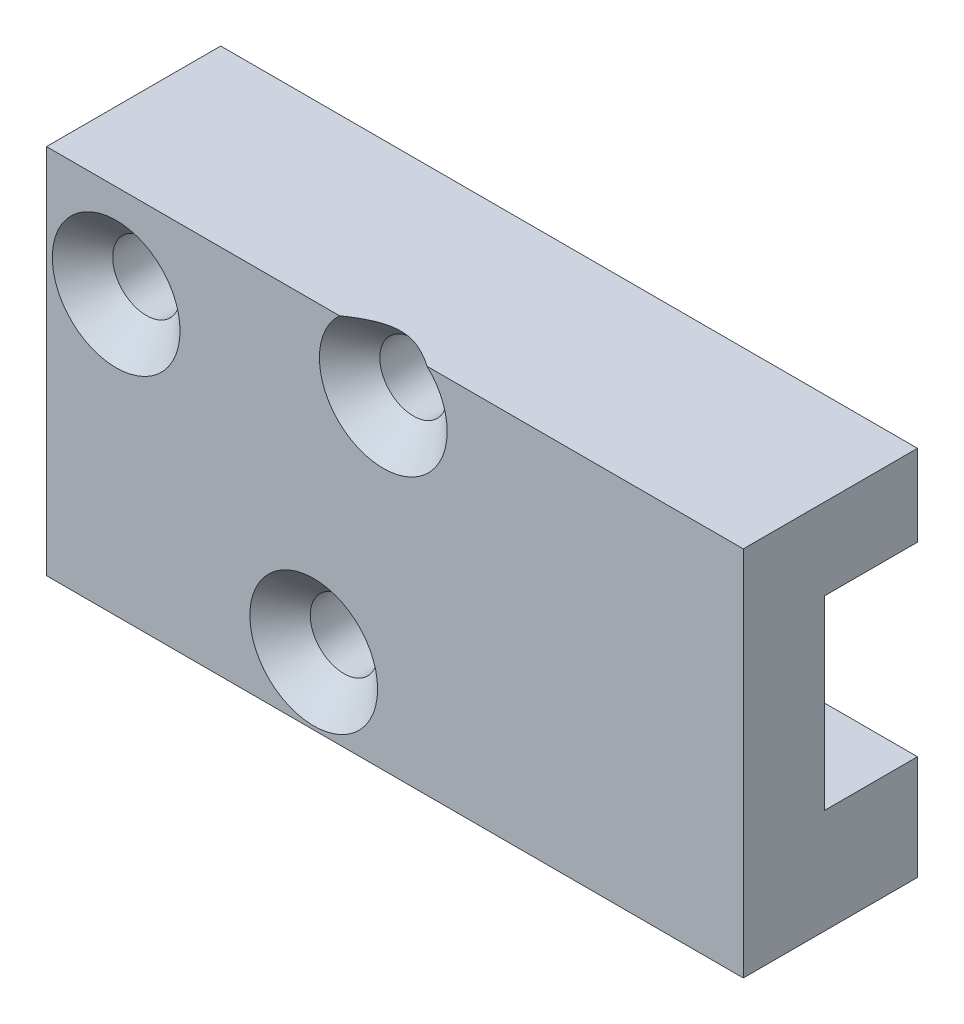
ISO-10303-21;
HEADER;
FILE_DESCRIPTION(('STEP AP214'),'2;1');
FILE_NAME('part.step','',(''),(''),'','','');
FILE_SCHEMA(('AUTOMOTIVE_DESIGN { 1 0 10303 214 1 1 1 1 }'));
ENDSEC;
DATA;
#1=APPLICATION_CONTEXT('core data for automotive mechanical design processes');
#2=APPLICATION_PROTOCOL_DEFINITION('international standard','automotive_design',2000,#1);
#3=PRODUCT_CONTEXT('',#1,'mechanical');
#4=PRODUCT('Part','Part','',(#3));
#5=PRODUCT_RELATED_PRODUCT_CATEGORY('part','',(#4));
#6=PRODUCT_DEFINITION_FORMATION('','',#4);
#7=PRODUCT_DEFINITION_CONTEXT('part definition',#1,'design');
#8=PRODUCT_DEFINITION('design','',#6,#7);
#9=PRODUCT_DEFINITION_SHAPE('','',#8);
#10=(LENGTH_UNIT() NAMED_UNIT(*) SI_UNIT(.MILLI.,.METRE.));
#11=(NAMED_UNIT(*) PLANE_ANGLE_UNIT() SI_UNIT($,.RADIAN.));
#12=(NAMED_UNIT(*) SI_UNIT($,.STERADIAN.) SOLID_ANGLE_UNIT());
#13=UNCERTAINTY_MEASURE_WITH_UNIT(LENGTH_MEASURE(1.E-05),#10,'distance_accuracy_value','');
#14=(GEOMETRIC_REPRESENTATION_CONTEXT(3) GLOBAL_UNCERTAINTY_ASSIGNED_CONTEXT((#13)) GLOBAL_UNIT_ASSIGNED_CONTEXT((#10,
#11,#12)) REPRESENTATION_CONTEXT('',''));
#15=CARTESIAN_POINT('',(0.,0.,0.));
#16=DIRECTION('',(0.,0.,1.));
#17=DIRECTION('',(1.,0.,0.));
#18=AXIS2_PLACEMENT_3D('',#15,#16,#17);
#19=CARTESIAN_POINT('',(0.,0.,8.07911505586116));
#20=DIRECTION('',(0.,0.,-1.));
#21=DIRECTION('',(-1.,0.,0.));
#22=AXIS2_PLACEMENT_3D('',#19,#20,#21);
#23=PLANE('',#22);
#24=CARTESIAN_POINT('',(102.394950361499,-11.8061342603226,8.07911505586116));
#25=DIRECTION('',(0.,0.,1.));
#26=DIRECTION('',(1.,0.,0.));
#27=AXIS2_PLACEMENT_3D('',#24,#25,#26);
#28=CIRCLE('',#27,2.75);
#29=CARTESIAN_POINT('',(105.144950361499,-11.8061342603226,8.07911505586116));
#30=VERTEX_POINT('',#29);
#31=EDGE_CURVE('E518',#30,#30,#28,.T.);
#32=ORIENTED_EDGE('',*,*,#31,.F.);
#33=EDGE_LOOP('',(#32));
#34=FACE_BOUND('',#33,.T.);
#35=CARTESIAN_POINT('',(110.89995175116,-20.9061342603226,8.07911505586116));
#36=DIRECTION('',(0.,0.,1.));
#37=DIRECTION('',(1.,0.,0.));
#38=AXIS2_PLACEMENT_3D('',#35,#36,#37);
#39=CIRCLE('',#38,2.75);
#40=CARTESIAN_POINT('',(113.64995175116,-20.9061342603226,8.07911505586116));
#41=VERTEX_POINT('',#40);
#42=EDGE_CURVE('E534',#41,#41,#39,.T.);
#43=ORIENTED_EDGE('',*,*,#42,.F.);
#44=EDGE_LOOP('',(#43));
#45=FACE_BOUND('',#44,.T.);
#46=CARTESIAN_POINT('',(113.894950361499,-9.80613426032264,8.07911505586116));
#47=DIRECTION('',(0.,0.,1.));
#48=DIRECTION('',(1.,0.,0.));
#49=AXIS2_PLACEMENT_3D('',#46,#47,#48);
#50=CIRCLE('',#49,2.75);
#51=CARTESIAN_POINT('',(112.007491752681,-7.80613426032264,8.07911505586116));
#52=VERTEX_POINT('',#51);
#53=CARTESIAN_POINT('',(115.782408970316,-7.80613426032264,8.07911505586116));
#54=VERTEX_POINT('',#53);
#55=EDGE_CURVE('E110',#52,#54,#50,.T.);
#56=ORIENTED_EDGE('',*,*,#55,.F.);
#57=DIRECTION('',(-1.,0.,0.));
#58=VECTOR('',#57,1.);
#59=CARTESIAN_POINT('',(99.3949503614988,-7.80613426032264,8.07911505586116));
#60=LINE('',#59,#58);
#61=CARTESIAN_POINT('',(99.3949503614988,-7.80613426032264,8.07911505586116));
#62=VERTEX_POINT('',#61);
#63=EDGE_CURVE('E316',#52,#62,#60,.T.);
#64=ORIENTED_EDGE('',*,*,#63,.T.);
#65=DIRECTION('',(0.,-1.,0.));
#66=VECTOR('',#65,1.);
#67=CARTESIAN_POINT('',(99.3949503614988,-23.8061342603226,8.07911505586116));
#68=LINE('',#67,#66);
#69=CARTESIAN_POINT('',(99.3949503614988,-23.8061342603226,8.07911505586116));
#70=VERTEX_POINT('',#69);
#71=EDGE_CURVE('E330',#62,#70,#68,.T.);
#72=ORIENTED_EDGE('',*,*,#71,.T.);
#73=DIRECTION('',(1.,0.,0.));
#74=VECTOR('',#73,1.);
#75=CARTESIAN_POINT('',(129.394950361499,-23.8061342603226,8.07911505586116));
#76=LINE('',#75,#74);
#77=CARTESIAN_POINT('',(129.394950361499,-23.8061342603226,8.07911505586116));
#78=VERTEX_POINT('',#77);
#79=EDGE_CURVE('E331',#70,#78,#76,.T.);
#80=ORIENTED_EDGE('',*,*,#79,.T.);
#81=DIRECTION('',(0.,1.,0.));
#82=VECTOR('',#81,1.);
#83=CARTESIAN_POINT('',(129.394950361499,-7.80613426032264,8.07911505586116));
#84=LINE('',#83,#82);
#85=CARTESIAN_POINT('',(129.394950361499,-7.80613426032264,8.07911505586116));
#86=VERTEX_POINT('',#85);
#87=EDGE_CURVE('E235',#78,#86,#84,.T.);
#88=ORIENTED_EDGE('',*,*,#87,.T.);
#89=EDGE_CURVE('E318',#86,#54,#60,.T.);
#90=ORIENTED_EDGE('',*,*,#89,.T.);
#91=EDGE_LOOP('',(#56,#64,#72,#80,#88,#90));
#92=FACE_BOUND('',#91,.T.);
#93=ADVANCED_FACE('F89',(#34,#45,#92),#23,.F.);
#94=CARTESIAN_POINT('',(0.,-18.3061342603226,4.57911505586116));
#95=DIRECTION('',(0.,1.,0.));
#96=DIRECTION('',(0.,0.,1.));
#97=AXIS2_PLACEMENT_3D('',#94,#95,#96);
#98=PLANE('',#97);
#99=DIRECTION('',(1.,0.,0.));
#100=VECTOR('',#99,1.);
#101=CARTESIAN_POINT('',(0.,-18.3061342603226,0.579115055861165));
#102=LINE('',#101,#100);
#103=CARTESIAN_POINT('',(110.394950361499,-18.3061342603226,0.579115055861165));
#104=VERTEX_POINT('',#103);
#105=CARTESIAN_POINT('',(116.394950361499,-18.3061342603226,0.579115055861165));
#106=VERTEX_POINT('',#105);
#107=EDGE_CURVE('E171',#104,#106,#102,.T.);
#108=ORIENTED_EDGE('',*,*,#107,.F.);
#109=DIRECTION('',(0.,0.,-1.));
#110=VECTOR('',#109,1.);
#111=CARTESIAN_POINT('',(110.394950361499,-18.3061342603226,4.57911505586116));
#112=LINE('',#111,#110);
#113=CARTESIAN_POINT('',(110.394950361499,-18.3061342603226,4.57911505586116));
#114=VERTEX_POINT('',#113);
#115=EDGE_CURVE('E104',#114,#104,#112,.T.);
#116=ORIENTED_EDGE('',*,*,#115,.F.);
#117=DIRECTION('',(1.,0.,0.));
#118=VECTOR('',#117,1.);
#119=CARTESIAN_POINT('',(0.,-18.3061342603226,4.57911505586116));
#120=LINE('',#119,#118);
#121=CARTESIAN_POINT('',(116.394950361499,-18.3061342603226,4.57911505586116));
#122=VERTEX_POINT('',#121);
#123=EDGE_CURVE('E173',#114,#122,#120,.T.);
#124=ORIENTED_EDGE('',*,*,#123,.T.);
#125=DIRECTION('',(0.,0.,-1.));
#126=VECTOR('',#125,1.);
#127=CARTESIAN_POINT('',(116.394950361499,-18.3061342603226,4.57911505586116));
#128=LINE('',#127,#126);
#129=EDGE_CURVE('E155',#122,#106,#128,.T.);
#130=ORIENTED_EDGE('',*,*,#129,.T.);
#131=EDGE_LOOP('',(#108,#116,#124,#130));
#132=FACE_BOUND('',#131,.T.);
#133=ADVANCED_FACE('F91',(#132),#98,.T.);
#134=CARTESIAN_POINT('',(110.384915749115,-21.3061174780348,4.57911505586116));
#135=DIRECTION('',(0.,0.,-1.));
#136=DIRECTION('',(-1.,0.,0.));
#137=AXIS2_PLACEMENT_3D('',#134,#135,#136);
#138=CYLINDRICAL_SURFACE('',#137,3.00000000000001);
#139=CARTESIAN_POINT('',(110.384915749115,-21.3061174780348,0.579115055861165));
#140=DIRECTION('',(0.,0.,1.));
#141=DIRECTION('',(1.,0.,0.));
#142=AXIS2_PLACEMENT_3D('',#139,#140,#141);
#143=CIRCLE('',#142,3.00000000000001);
#144=CARTESIAN_POINT('',(107.39995175116,-21.0061342603226,0.579115055861165));
#145=VERTEX_POINT('',#144);
#146=EDGE_CURVE('E200',#104,#145,#143,.T.);
#147=ORIENTED_EDGE('',*,*,#146,.T.);
#148=DIRECTION('',(0.,0.,-1.));
#149=VECTOR('',#148,1.);
#150=CARTESIAN_POINT('',(107.39995175116,-21.0061342603226,4.57911505586116));
#151=LINE('',#150,#149);
#152=CARTESIAN_POINT('',(107.39995175116,-21.0061342603226,4.57911505586116));
#153=VERTEX_POINT('',#152);
#154=EDGE_CURVE('E191',#153,#145,#151,.T.);
#155=ORIENTED_EDGE('',*,*,#154,.F.);
#156=CARTESIAN_POINT('',(110.384915749115,-21.3061174780348,4.57911505586116));
#157=DIRECTION('',(0.,0.,1.));
#158=DIRECTION('',(1.,0.,0.));
#159=AXIS2_PLACEMENT_3D('',#156,#157,#158);
#160=CIRCLE('',#159,3.00000000000001);
#161=EDGE_CURVE('E177',#114,#153,#160,.T.);
#162=ORIENTED_EDGE('',*,*,#161,.F.);
#163=ORIENTED_EDGE('',*,*,#115,.T.);
#164=EDGE_LOOP('',(#147,#155,#162,#163));
#165=FACE_BOUND('',#164,.T.);
#166=ADVANCED_FACE('F198',(#165),#138,.T.);
#167=CARTESIAN_POINT('',(107.39995175116,0.,4.57911505586116));
#168=DIRECTION('',(-1.,0.,0.));
#169=DIRECTION('',(0.,0.,1.));
#170=AXIS2_PLACEMENT_3D('',#167,#168,#169);
#171=PLANE('',#170);
#172=DIRECTION('',(0.,1.,0.));
#173=VECTOR('',#172,1.);
#174=CARTESIAN_POINT('',(107.39995175116,0.,0.579115055861165));
#175=LINE('',#174,#173);
#176=CARTESIAN_POINT('',(107.39995175116,-23.8061342603226,0.579115055861165));
#177=VERTEX_POINT('',#176);
#178=EDGE_CURVE('E207',#177,#145,#175,.T.);
#179=ORIENTED_EDGE('',*,*,#178,.F.);
#180=DIRECTION('',(0.,0.,-1.));
#181=VECTOR('',#180,1.);
#182=CARTESIAN_POINT('',(107.39995175116,-23.8061342603226,4.57911505586116));
#183=LINE('',#182,#181);
#184=CARTESIAN_POINT('',(107.39995175116,-23.8061342603226,4.57911505586116));
#185=VERTEX_POINT('',#184);
#186=EDGE_CURVE('E188',#185,#177,#183,.T.);
#187=ORIENTED_EDGE('',*,*,#186,.F.);
#188=DIRECTION('',(0.,1.,0.));
#189=VECTOR('',#188,1.);
#190=CARTESIAN_POINT('',(107.39995175116,0.,4.57911505586116));
#191=LINE('',#190,#189);
#192=EDGE_CURVE('E250',#185,#153,#191,.T.);
#193=ORIENTED_EDGE('',*,*,#192,.T.);
#194=ORIENTED_EDGE('',*,*,#154,.T.);
#195=EDGE_LOOP('',(#179,#187,#193,#194));
#196=FACE_BOUND('',#195,.T.);
#197=ADVANCED_FACE('F249',(#196),#171,.T.);
#198=CARTESIAN_POINT('',(0.,-23.8061342603226,4.57911505586116));
#199=DIRECTION('',(0.,-1.,0.));
#200=DIRECTION('',(0.,0.,-1.));
#201=AXIS2_PLACEMENT_3D('',#198,#199,#200);
#202=PLANE('',#201);
#203=DIRECTION('',(-1.,0.,0.));
#204=VECTOR('',#203,1.);
#205=CARTESIAN_POINT('',(0.,-23.8061342603226,0.579115055861165));
#206=LINE('',#205,#204);
#207=CARTESIAN_POINT('',(129.394950361499,-23.8061342603226,0.579115055861165));
#208=VERTEX_POINT('',#207);
#209=EDGE_CURVE('E222',#208,#177,#206,.T.);
#210=ORIENTED_EDGE('',*,*,#209,.F.);
#211=DIRECTION('',(0.,0.,-1.));
#212=VECTOR('',#211,1.);
#213=CARTESIAN_POINT('',(129.394950361499,-23.8061342603226,4.57911505586116));
#214=LINE('',#213,#212);
#215=EDGE_CURVE('E185',#78,#208,#214,.T.);
#216=ORIENTED_EDGE('',*,*,#215,.F.);
#217=ORIENTED_EDGE('',*,*,#79,.F.);
#218=DIRECTION('',(0.,0.,-1.));
#219=VECTOR('',#218,1.);
#220=CARTESIAN_POINT('',(99.3949503614988,-23.8061342603226,8.07911505586116));
#221=LINE('',#220,#219);
#222=CARTESIAN_POINT('',(99.3949503614988,-23.8061342603226,0.579115055861165));
#223=VERTEX_POINT('',#222);
#224=EDGE_CURVE('E337',#70,#223,#221,.T.);
#225=ORIENTED_EDGE('',*,*,#224,.T.);
#226=DIRECTION('',(-1.,0.,0.));
#227=VECTOR('',#226,1.);
#228=CARTESIAN_POINT('',(101.39995175116,-23.8061342603226,0.579115055861165));
#229=LINE('',#228,#227);
#230=CARTESIAN_POINT('',(101.39995175116,-23.8061342603226,0.579115055861165));
#231=VERTEX_POINT('',#230);
#232=EDGE_CURVE('E372',#231,#223,#229,.T.);
#233=ORIENTED_EDGE('',*,*,#232,.F.);
#234=DIRECTION('',(0.,0.,-1.));
#235=VECTOR('',#234,1.);
#236=CARTESIAN_POINT('',(101.39995175116,-23.8061342603226,4.57911505586116));
#237=LINE('',#236,#235);
#238=CARTESIAN_POINT('',(101.39995175116,-23.8061342603226,4.57911505586116));
#239=VERTEX_POINT('',#238);
#240=EDGE_CURVE('E406',#239,#231,#237,.T.);
#241=ORIENTED_EDGE('',*,*,#240,.F.);
#242=DIRECTION('',(1.,0.,0.));
#243=VECTOR('',#242,1.);
#244=CARTESIAN_POINT('',(129.394950361499,-23.8061342603226,4.57911505586116));
#245=LINE('',#244,#243);
#246=EDGE_CURVE('E245',#239,#185,#245,.T.);
#247=ORIENTED_EDGE('',*,*,#246,.T.);
#248=ORIENTED_EDGE('',*,*,#186,.T.);
#249=EDGE_LOOP('',(#210,#216,#217,#225,#233,#241,#247,#248));
#250=FACE_BOUND('',#249,.T.);
#251=ADVANCED_FACE('F239',(#250),#202,.T.);
#252=CARTESIAN_POINT('',(129.394950361499,0.,4.57911505586116));
#253=DIRECTION('',(1.,0.,0.));
#254=DIRECTION('',(0.,0.,-1.));
#255=AXIS2_PLACEMENT_3D('',#252,#253,#254);
#256=PLANE('',#255);
#257=DIRECTION('',(0.,-1.,0.));
#258=VECTOR('',#257,1.);
#259=CARTESIAN_POINT('',(129.394950361499,0.,0.579115055861165));
#260=LINE('',#259,#258);
#261=CARTESIAN_POINT('',(129.394950361499,-19.3061342603226,0.579115055861165));
#262=VERTEX_POINT('',#261);
#263=EDGE_CURVE('E165',#262,#208,#260,.T.);
#264=ORIENTED_EDGE('',*,*,#263,.F.);
#265=DIRECTION('',(0.,0.,-1.));
#266=VECTOR('',#265,1.);
#267=CARTESIAN_POINT('',(129.394950361499,-19.3061342603226,4.57911505586116));
#268=LINE('',#267,#266);
#269=CARTESIAN_POINT('',(129.394950361499,-19.3061342603226,4.57911505586116));
#270=VERTEX_POINT('',#269);
#271=EDGE_CURVE('E154',#270,#262,#268,.T.);
#272=ORIENTED_EDGE('',*,*,#271,.F.);
#273=DIRECTION('',(0.,1.,0.));
#274=VECTOR('',#273,1.);
#275=CARTESIAN_POINT('',(129.394950361499,-7.80613426032264,4.57911505586116));
#276=LINE('',#275,#274);
#277=CARTESIAN_POINT('',(129.394950361499,-11.3061342603226,4.57911505586116));
#278=VERTEX_POINT('',#277);
#279=EDGE_CURVE('E340',#270,#278,#276,.T.);
#280=ORIENTED_EDGE('',*,*,#279,.T.);
#281=DIRECTION('',(0.,0.,-1.));
#282=VECTOR('',#281,1.);
#283=CARTESIAN_POINT('',(129.394950361499,-11.3061342603226,4.57911505586116));
#284=LINE('',#283,#282);
#285=CARTESIAN_POINT('',(129.394950361499,-11.3061342603226,0.579115055861165));
#286=VERTEX_POINT('',#285);
#287=EDGE_CURVE('E414',#278,#286,#284,.T.);
#288=ORIENTED_EDGE('',*,*,#287,.T.);
#289=DIRECTION('',(0.,-1.,0.));
#290=VECTOR('',#289,1.);
#291=CARTESIAN_POINT('',(129.394950361499,-7.80613426032264,0.579115055861165));
#292=LINE('',#291,#290);
#293=CARTESIAN_POINT('',(129.394950361499,-7.80613426032264,0.579115055861165));
#294=VERTEX_POINT('',#293);
#295=EDGE_CURVE('E366',#294,#286,#292,.T.);
#296=ORIENTED_EDGE('',*,*,#295,.F.);
#297=DIRECTION('',(0.,0.,-1.));
#298=VECTOR('',#297,1.);
#299=CARTESIAN_POINT('',(129.394950361499,-7.80613426032264,8.07911505586116));
#300=LINE('',#299,#298);
#301=EDGE_CURVE('E211',#86,#294,#300,.T.);
#302=ORIENTED_EDGE('',*,*,#301,.F.);
#303=ORIENTED_EDGE('',*,*,#87,.F.);
#304=ORIENTED_EDGE('',*,*,#215,.T.);
#305=EDGE_LOOP('',(#264,#272,#280,#288,#296,#302,#303,#304));
#306=FACE_BOUND('',#305,.T.);
#307=ADVANCED_FACE('F227',(#306),#256,.T.);
#308=CARTESIAN_POINT('',(0.,-19.3061342603226,4.57911505586116));
#309=DIRECTION('',(0.,1.,0.));
#310=DIRECTION('',(0.,0.,1.));
#311=AXIS2_PLACEMENT_3D('',#308,#309,#310);
#312=PLANE('',#311);
#313=DIRECTION('',(1.,0.,0.));
#314=VECTOR('',#313,1.);
#315=CARTESIAN_POINT('',(0.,-19.3061342603226,0.579115055861165));
#316=LINE('',#315,#314);
#317=CARTESIAN_POINT('',(116.394950361499,-19.3061342603226,0.579115055861165));
#318=VERTEX_POINT('',#317);
#319=EDGE_CURVE('E158',#318,#262,#316,.T.);
#320=ORIENTED_EDGE('',*,*,#319,.F.);
#321=DIRECTION('',(0.,0.,-1.));
#322=VECTOR('',#321,1.);
#323=CARTESIAN_POINT('',(116.394950361499,-19.3061342603226,4.57911505586116));
#324=LINE('',#323,#322);
#325=CARTESIAN_POINT('',(116.394950361499,-19.3061342603226,4.57911505586116));
#326=VERTEX_POINT('',#325);
#327=EDGE_CURVE('E145',#326,#318,#324,.T.);
#328=ORIENTED_EDGE('',*,*,#327,.F.);
#329=DIRECTION('',(1.,0.,0.));
#330=VECTOR('',#329,1.);
#331=CARTESIAN_POINT('',(0.,-19.3061342603226,4.57911505586116));
#332=LINE('',#331,#330);
#333=EDGE_CURVE('E118',#326,#270,#332,.T.);
#334=ORIENTED_EDGE('',*,*,#333,.T.);
#335=ORIENTED_EDGE('',*,*,#271,.T.);
#336=EDGE_LOOP('',(#320,#328,#334,#335));
#337=FACE_BOUND('',#336,.T.);
#338=ADVANCED_FACE('F159',(#337),#312,.T.);
#339=CARTESIAN_POINT('',(116.394950361499,0.,4.57911505586116));
#340=DIRECTION('',(1.,0.,0.));
#341=DIRECTION('',(0.,0.,-1.));
#342=AXIS2_PLACEMENT_3D('',#339,#340,#341);
#343=PLANE('',#342);
#344=DIRECTION('',(0.,-1.,0.));
#345=VECTOR('',#344,1.);
#346=CARTESIAN_POINT('',(116.394950361499,0.,0.579115055861165));
#347=LINE('',#346,#345);
#348=EDGE_CURVE('E150',#106,#318,#347,.T.);
#349=ORIENTED_EDGE('',*,*,#348,.F.);
#350=ORIENTED_EDGE('',*,*,#129,.F.);
#351=DIRECTION('',(0.,-1.,0.));
#352=VECTOR('',#351,1.);
#353=CARTESIAN_POINT('',(116.394950361499,0.,4.57911505586116));
#354=LINE('',#353,#352);
#355=EDGE_CURVE('E151',#122,#326,#354,.T.);
#356=ORIENTED_EDGE('',*,*,#355,.T.);
#357=ORIENTED_EDGE('',*,*,#327,.T.);
#358=EDGE_LOOP('',(#349,#350,#356,#357));
#359=FACE_BOUND('',#358,.T.);
#360=ADVANCED_FACE('F147',(#359),#343,.T.);
#361=CARTESIAN_POINT('',(0.,0.,0.579115055861165));
#362=DIRECTION('',(0.,0.,1.));
#363=DIRECTION('',(1.,0.,0.));
#364=AXIS2_PLACEMENT_3D('',#361,#362,#363);
#365=PLANE('',#364);
#366=CARTESIAN_POINT('',(110.89995175116,-20.9061342603226,0.579115055861165));
#367=DIRECTION('',(0.,0.,1.));
#368=DIRECTION('',(1.,0.,0.));
#369=AXIS2_PLACEMENT_3D('',#366,#367,#368);
#370=CIRCLE('',#369,1.44999999999999);
#371=CARTESIAN_POINT('',(112.34995175116,-20.9061342603226,0.579115055861165));
#372=VERTEX_POINT('',#371);
#373=EDGE_CURVE('E431',#372,#372,#370,.T.);
#374=ORIENTED_EDGE('',*,*,#373,.T.);
#375=EDGE_LOOP('',(#374));
#376=FACE_BOUND('',#375,.T.);
#377=ORIENTED_EDGE('',*,*,#107,.T.);
#378=ORIENTED_EDGE('',*,*,#348,.T.);
#379=ORIENTED_EDGE('',*,*,#319,.T.);
#380=ORIENTED_EDGE('',*,*,#263,.T.);
#381=ORIENTED_EDGE('',*,*,#209,.T.);
#382=ORIENTED_EDGE('',*,*,#178,.T.);
#383=ORIENTED_EDGE('',*,*,#146,.F.);
#384=EDGE_LOOP('',(#377,#378,#379,#380,#381,#382,#383));
#385=FACE_BOUND('',#384,.T.);
#386=ADVANCED_FACE('F168',(#376,#385),#365,.F.);
#387=CARTESIAN_POINT('',(0.,0.,4.57911505586116));
#388=DIRECTION('',(0.,0.,-1.));
#389=DIRECTION('',(-1.,0.,0.));
#390=AXIS2_PLACEMENT_3D('',#387,#388,#389);
#391=PLANE('',#390);
#392=DIRECTION('',(-1.,0.,0.));
#393=VECTOR('',#392,1.);
#394=CARTESIAN_POINT('',(129.394950361499,-11.3061342603226,4.57911505586116));
#395=LINE('',#394,#393);
#396=CARTESIAN_POINT('',(116.394950361499,-11.3061342603226,4.57911505586116));
#397=VERTEX_POINT('',#396);
#398=EDGE_CURVE('E393',#278,#397,#395,.T.);
#399=ORIENTED_EDGE('',*,*,#398,.F.);
#400=ORIENTED_EDGE('',*,*,#279,.F.);
#401=ORIENTED_EDGE('',*,*,#333,.F.);
#402=ORIENTED_EDGE('',*,*,#355,.F.);
#403=ORIENTED_EDGE('',*,*,#123,.F.);
#404=ORIENTED_EDGE('',*,*,#161,.T.);
#405=ORIENTED_EDGE('',*,*,#192,.F.);
#406=ORIENTED_EDGE('',*,*,#246,.F.);
#407=DIRECTION('',(0.,-1.,0.));
#408=VECTOR('',#407,1.);
#409=CARTESIAN_POINT('',(101.39995175116,-21.0061342603226,4.57911505586116));
#410=LINE('',#409,#408);
#411=CARTESIAN_POINT('',(101.39995175116,-21.0061342603226,4.57911505586116));
#412=VERTEX_POINT('',#411);
#413=EDGE_CURVE('E397',#412,#239,#410,.T.);
#414=ORIENTED_EDGE('',*,*,#413,.F.);
#415=CARTESIAN_POINT('',(110.394950361499,-21.3061342603226,4.57911505586116));
#416=DIRECTION('',(0.,0.,1.));
#417=DIRECTION('',(1.,0.,0.));
#418=AXIS2_PLACEMENT_3D('',#415,#416,#417);
#419=CIRCLE('',#418,9.);
#420=CARTESIAN_POINT('',(110.394950361499,-12.3061342603226,4.57911505586116));
#421=VERTEX_POINT('',#420);
#422=EDGE_CURVE('E401',#421,#412,#419,.T.);
#423=ORIENTED_EDGE('',*,*,#422,.F.);
#424=DIRECTION('',(-1.,0.,0.));
#425=VECTOR('',#424,1.);
#426=CARTESIAN_POINT('',(116.394950361499,-12.3061342603226,4.57911505586116));
#427=LINE('',#426,#425);
#428=CARTESIAN_POINT('',(116.394950361499,-12.3061342603226,4.57911505586116));
#429=VERTEX_POINT('',#428);
#430=EDGE_CURVE('E384',#429,#421,#427,.T.);
#431=ORIENTED_EDGE('',*,*,#430,.F.);
#432=DIRECTION('',(0.,-1.,0.));
#433=VECTOR('',#432,1.);
#434=CARTESIAN_POINT('',(116.394950361499,-11.3061342603226,4.57911505586116));
#435=LINE('',#434,#433);
#436=EDGE_CURVE('E388',#397,#429,#435,.T.);
#437=ORIENTED_EDGE('',*,*,#436,.F.);
#438=EDGE_LOOP('',(#399,#400,#401,#402,#403,#404,#405,#406,#414,#423,#431,#437));
#439=FACE_BOUND('',#438,.T.);
#440=ADVANCED_FACE('F457',(#439),#391,.T.);
#441=CARTESIAN_POINT('',(99.3949503614988,-7.80613426032264,8.07911505586116));
#442=DIRECTION('',(0.,-1.,0.));
#443=DIRECTION('',(0.,0.,-1.));
#444=AXIS2_PLACEMENT_3D('',#441,#442,#443);
#445=PLANE('',#444);
#446=ORIENTED_EDGE('',*,*,#63,.F.);
#447=CARTESIAN_POINT('',(109.900805385075,-7.80613426032264,9.79601488602188));
#448=CARTESIAN_POINT('',(109.992309743994,-7.80613426032264,9.71420702747813));
#449=CARTESIAN_POINT('',(110.084083938045,-7.80613426032264,9.63269825352629));
#450=CARTESIAN_POINT('',(110.268314485797,-7.80613426032264,9.47043804128163));
#451=CARTESIAN_POINT('',(110.360770903457,-7.80613426032264,9.38968667564838));
#452=CARTESIAN_POINT('',(110.546850244825,-7.80613426032264,9.22880550167071));
#453=CARTESIAN_POINT('',(110.640476297317,-7.80613426032264,9.1486793057164));
#454=CARTESIAN_POINT('',(110.828722319881,-7.80613426032264,8.98960930241967));
#455=CARTESIAN_POINT('',(110.92334224718,-7.80613426032264,8.91066544454587));
#456=CARTESIAN_POINT('',(111.119294324292,-7.80613426032264,8.74978109850728));
#457=CARTESIAN_POINT('',(111.220699553489,-7.80613426032264,8.6679293651462));
#458=CARTESIAN_POINT('',(111.4252599107,-7.80613426032264,8.50644467322333));
#459=CARTESIAN_POINT('',(111.528414939394,-7.80613426032264,8.42681158940257));
#460=CARTESIAN_POINT('',(111.736823957662,-7.80613426032264,8.27067051596982));
#461=CARTESIAN_POINT('',(111.842074436936,-7.80613426032264,8.19415786297733));
#462=CARTESIAN_POINT('',(112.055482115096,-7.80613426032264,8.04532149468636));
#463=CARTESIAN_POINT('',(112.163638388872,-7.80613426032264,7.97299646878594));
#464=CARTESIAN_POINT('',(112.353257708299,-7.80613426032264,7.8535975761818));
#465=CARTESIAN_POINT('',(112.433808198422,-7.80613426032264,7.80508207047615));
#466=CARTESIAN_POINT('',(112.597347170915,-7.80613426032264,7.71222983823085));
#467=CARTESIAN_POINT('',(112.680336496499,-7.80613426032264,7.66789457982348));
#468=CARTESIAN_POINT('',(112.848407035819,-7.80613426032264,7.58520565745459));
#469=CARTESIAN_POINT('',(112.933464671191,-7.80613426032264,7.54680465021529));
#470=CARTESIAN_POINT('',(113.106566008617,-7.80613426032264,7.47743566982131));
#471=CARTESIAN_POINT('',(113.194607427126,-7.80613426032264,7.44646215261207));
#472=CARTESIAN_POINT('',(113.342479751799,-7.80613426032264,7.40326639733507));
#473=CARTESIAN_POINT('',(113.40149832392,-7.80613426032264,7.38826698924057));
#474=CARTESIAN_POINT('',(113.520537446788,-7.80613426032264,7.36302915808315));
#475=CARTESIAN_POINT('',(113.580557583346,-7.80613426032264,7.35278881512282));
#476=CARTESIAN_POINT('',(113.701090108446,-7.80613426032264,7.33760214384913));
#477=CARTESIAN_POINT('',(113.761600474917,-7.80613426032264,7.332639994147));
#478=CARTESIAN_POINT('',(113.882825306806,-7.80613426032264,7.32823461322051));
#479=CARTESIAN_POINT('',(113.943539771788,-7.80613426032264,7.32879137021042));
#480=CARTESIAN_POINT('',(114.064604883158,-7.80613426032264,7.33538811874263));
#481=CARTESIAN_POINT('',(114.12495582935,-7.80613426032264,7.34142270090986));
#482=CARTESIAN_POINT('',(114.24492210687,-7.80613426032264,7.35863540891263));
#483=CARTESIAN_POINT('',(114.304537267318,-7.80613426032264,7.36981470731951));
#484=CARTESIAN_POINT('',(114.422935498066,-7.80613426032264,7.39682644300126));
#485=CARTESIAN_POINT('',(114.481714397224,-7.80613426032264,7.41267692517502));
#486=CARTESIAN_POINT('',(114.598030985541,-7.80613426032264,7.44837357828554));
#487=CARTESIAN_POINT('',(114.655568662758,-7.80613426032264,7.46821978764653));
#488=CARTESIAN_POINT('',(114.784432974378,-7.80613426032264,7.51697658219658));
#489=CARTESIAN_POINT('',(114.855375916726,-7.80613426032264,7.5468957717595));
#490=CARTESIAN_POINT('',(114.995326153277,-7.80613426032264,7.61099012556665));
#491=CARTESIAN_POINT('',(115.064332491915,-7.80613426032264,7.6451673471081));
#492=CARTESIAN_POINT('',(115.200696974012,-7.80613426032264,7.71691887268941));
#493=CARTESIAN_POINT('',(115.268052011232,-7.80613426032264,7.75449903527502));
#494=CARTESIAN_POINT('',(115.401222018802,-7.80613426032264,7.83229989922316));
#495=CARTESIAN_POINT('',(115.467036764816,-7.80613426032264,7.87252098201224));
#496=CARTESIAN_POINT('',(115.598252336698,-7.80613426032264,7.95563838873102));
#497=CARTESIAN_POINT('',(115.66363424911,-7.80613426032264,7.99856443214888));
#498=CARTESIAN_POINT('',(115.793231208958,-7.80613426032264,8.08614062816743));
#499=CARTESIAN_POINT('',(115.857446221863,-7.80613426032264,8.13079083166726));
#500=CARTESIAN_POINT('',(115.984806354509,-7.80613426032264,8.22143221492937));
#501=CARTESIAN_POINT('',(116.047952642477,-7.80613426032264,8.26742175777895));
#502=CARTESIAN_POINT('',(116.173393087057,-7.80613426032264,8.36054074685392));
#503=CARTESIAN_POINT('',(116.235687275372,-7.80613426032264,8.40767015048733));
#504=CARTESIAN_POINT('',(116.444671819356,-7.80613426032264,8.56827753020284));
#505=CARTESIAN_POINT('',(116.589693972724,-7.80613426032264,8.68392590149867));
#506=CARTESIAN_POINT('',(116.876894406519,-7.80613426032264,8.91871079017705));
#507=CARTESIAN_POINT('',(117.01907226142,-7.80613426032264,9.03784782301327));
#508=CARTESIAN_POINT('',(117.301404534125,-7.80613426032264,9.27860818262785));
#509=CARTESIAN_POINT('',(117.441558085495,-7.80613426032264,9.40023252317576));
#510=CARTESIAN_POINT('',(117.720314633985,-7.80613426032264,9.64524809847233));
#511=CARTESIAN_POINT('',(117.858917585765,-7.80613426032264,9.76863938464706));
#512=CARTESIAN_POINT('',(118.135217035283,-7.80613426032264,10.0169919917209));
#513=CARTESIAN_POINT('',(118.272911121639,-7.80613426032264,10.1419559913877));
#514=CARTESIAN_POINT('',(118.547369770433,-7.80613426032264,10.392901378568));
#515=CARTESIAN_POINT('',(118.684134325457,-7.80613426032264,10.5188827741778));
#516=CARTESIAN_POINT('',(119.093260964414,-7.80613426032264,10.8979409273378));
#517=CARTESIAN_POINT('',(119.364529138562,-7.80613426032264,11.1521978417466));
#518=CARTESIAN_POINT('',(119.873130641392,-7.80613426032264,11.6324931995292));
#519=CARTESIAN_POINT('',(120.110677289535,-7.80613426032264,11.8583065181052));
#520=CARTESIAN_POINT('',(120.584705860557,-7.80613426032264,12.3110847824837));
#521=CARTESIAN_POINT('',(120.821187698481,-7.80613426032264,12.5380498172079));
#522=CARTESIAN_POINT('',(121.292519106397,-7.80613426032264,12.9920134256783));
#523=CARTESIAN_POINT('',(121.527371492057,-7.80613426032264,13.2190090790957));
#524=CARTESIAN_POINT('',(121.996433930884,-7.80613426032264,13.6736214553035));
#525=CARTESIAN_POINT('',(122.230644039458,-7.80613426032264,13.9012381209105));
#526=CARTESIAN_POINT('',(122.464631295489,-7.80613426032264,14.1290827438925));
#527=B_SPLINE_CURVE_WITH_KNOTS('',3,(#447,#448,#449,#450,#451,#452,#453,#454,#455,#456,#457,
#458,#459,#460,#461,#462,#463,#464,#465,#466,#467,#468,#469,#470,#471,#472,#473,#474,#475,#476,
#477,#478,#479,#480,#481,#482,#483,#484,#485,#486,#487,#488,#489,#490,#491,#492,#493,#494,#495,
#496,#497,#498,#499,#500,#501,#502,#503,#504,#505,#506,#507,#508,#509,#510,#511,#512,#513,#514,
#515,#516,#517,#518,#519,#520,#521,#522,#523,#524,#525,#526),.UNSPECIFIED.,.F.,.F.,(4,2,2,2,2,2,
2,2,2,2,2,2,2,2,2,2,2,2,2,2,2,2,2,2,2,2,2,2,2,2,2,2,2,2,2,2,2,2,2,4),(0.,0.368227749454287,
0.736490469614875,1.10617764507637,1.47584897530441,1.86677962296275,2.25768815482343,
2.64798931109718,3.03816764706658,3.32017438719344,3.60227980400288,3.88200334647661,
4.16151744219673,4.34403672480508,4.52648231160926,4.70837946304545,4.89027622603722,
5.07199356039744,5.25375233186235,5.43622265738085,5.61869473767746,5.84949112519625,
6.08039945918738,6.31171317348254,6.54306037008246,6.77766880280924,7.01228416674452,
7.2466239192211,7.48095492885591,8.0373237823302,8.59377525888143,9.15045823991272,
9.70715745598642,10.2649868133799,10.8228206143102,11.9381923577376,12.9214387086625,
13.9047621655896,14.8846303059351,15.8644110746887),.UNSPECIFIED.);
#528=EDGE_CURVE('E12',#52,#54,#527,.T.);
#529=ORIENTED_EDGE('',*,*,#528,.T.);
#530=ORIENTED_EDGE('',*,*,#89,.F.);
#531=ORIENTED_EDGE('',*,*,#301,.T.);
#532=DIRECTION('',(-1.,0.,0.));
#533=VECTOR('',#532,1.);
#534=CARTESIAN_POINT('',(129.394950361499,-7.80613426032264,0.579115055861165));
#535=LINE('',#534,#533);
#536=CARTESIAN_POINT('',(99.3949503614988,-7.80613426032264,0.579115055861165));
#537=VERTEX_POINT('',#536);
#538=EDGE_CURVE('E361',#294,#537,#535,.T.);
#539=ORIENTED_EDGE('',*,*,#538,.T.);
#540=DIRECTION('',(0.,0.,-1.));
#541=VECTOR('',#540,1.);
#542=CARTESIAN_POINT('',(99.3949503614988,-7.80613426032264,8.07911505586116));
#543=LINE('',#542,#541);
#544=EDGE_CURVE('E215',#62,#537,#543,.T.);
#545=ORIENTED_EDGE('',*,*,#544,.F.);
#546=EDGE_LOOP('',(#446,#529,#530,#531,#539,#545));
#547=FACE_BOUND('',#546,.T.);
#548=ADVANCED_FACE('F323',(#547),#445,.F.);
#549=CARTESIAN_POINT('',(99.3949503614988,-23.8061342603226,8.07911505586116));
#550=DIRECTION('',(1.,0.,0.));
#551=DIRECTION('',(0.,0.,-1.));
#552=AXIS2_PLACEMENT_3D('',#549,#550,#551);
#553=PLANE('',#552);
#554=ORIENTED_EDGE('',*,*,#544,.T.);
#555=DIRECTION('',(0.,-1.,0.));
#556=VECTOR('',#555,1.);
#557=CARTESIAN_POINT('',(99.3949503614988,-7.80613426032264,0.579115055861165));
#558=LINE('',#557,#556);
#559=EDGE_CURVE('E358',#537,#223,#558,.T.);
#560=ORIENTED_EDGE('',*,*,#559,.T.);
#561=ORIENTED_EDGE('',*,*,#224,.F.);
#562=ORIENTED_EDGE('',*,*,#71,.F.);
#563=EDGE_LOOP('',(#554,#560,#561,#562));
#564=FACE_BOUND('',#563,.T.);
#565=ADVANCED_FACE('F355',(#564),#553,.F.);
#566=CARTESIAN_POINT('',(110.394950361499,-21.3061342603226,4.57911505586116));
#567=DIRECTION('',(0.,0.,-1.));
#568=DIRECTION('',(-1.,0.,0.));
#569=AXIS2_PLACEMENT_3D('',#566,#567,#568);
#570=CYLINDRICAL_SURFACE('',#569,9.);
#571=CARTESIAN_POINT('',(110.394950361499,-21.3061342603226,0.579115055861165));
#572=DIRECTION('',(0.,0.,1.));
#573=DIRECTION('',(1.,0.,0.));
#574=AXIS2_PLACEMENT_3D('',#571,#572,#573);
#575=CIRCLE('',#574,9.);
#576=CARTESIAN_POINT('',(110.394950361499,-12.3061342603226,0.579115055861165));
#577=VERTEX_POINT('',#576);
#578=CARTESIAN_POINT('',(101.39995175116,-21.0061342603226,0.579115055861165));
#579=VERTEX_POINT('',#578);
#580=EDGE_CURVE('E341',#577,#579,#575,.T.);
#581=ORIENTED_EDGE('',*,*,#580,.F.);
#582=DIRECTION('',(0.,0.,-1.));
#583=VECTOR('',#582,1.);
#584=CARTESIAN_POINT('',(110.394950361499,-12.3061342603226,4.57911505586116));
#585=LINE('',#584,#583);
#586=EDGE_CURVE('E428',#421,#577,#585,.T.);
#587=ORIENTED_EDGE('',*,*,#586,.F.);
#588=ORIENTED_EDGE('',*,*,#422,.T.);
#589=DIRECTION('',(0.,0.,-1.));
#590=VECTOR('',#589,1.);
#591=CARTESIAN_POINT('',(101.39995175116,-21.0061342603226,4.57911505586116));
#592=LINE('',#591,#590);
#593=EDGE_CURVE('E389',#412,#579,#592,.T.);
#594=ORIENTED_EDGE('',*,*,#593,.T.);
#595=EDGE_LOOP('',(#581,#587,#588,#594));
#596=FACE_BOUND('',#595,.T.);
#597=ADVANCED_FACE('F456',(#596),#570,.F.);
#598=CARTESIAN_POINT('',(116.394950361499,-12.3061342603226,4.57911505586116));
#599=DIRECTION('',(0.,-1.,0.));
#600=DIRECTION('',(1.,0.,0.));
#601=AXIS2_PLACEMENT_3D('',#598,#599,#600);
#602=PLANE('',#601);
#603=DIRECTION('',(-1.,0.,0.));
#604=VECTOR('',#603,1.);
#605=CARTESIAN_POINT('',(116.394950361499,-12.3061342603226,0.579115055861165));
#606=LINE('',#605,#604);
#607=CARTESIAN_POINT('',(116.394950361499,-12.3061342603226,0.579115055861165));
#608=VERTEX_POINT('',#607);
#609=EDGE_CURVE('E404',#608,#577,#606,.T.);
#610=ORIENTED_EDGE('',*,*,#609,.F.);
#611=DIRECTION('',(0.,0.,-1.));
#612=VECTOR('',#611,1.);
#613=CARTESIAN_POINT('',(116.394950361499,-12.3061342603226,4.57911505586116));
#614=LINE('',#613,#612);
#615=EDGE_CURVE('E425',#429,#608,#614,.T.);
#616=ORIENTED_EDGE('',*,*,#615,.F.);
#617=ORIENTED_EDGE('',*,*,#430,.T.);
#618=ORIENTED_EDGE('',*,*,#586,.T.);
#619=EDGE_LOOP('',(#610,#616,#617,#618));
#620=FACE_BOUND('',#619,.T.);
#621=ADVANCED_FACE('F452',(#620),#602,.T.);
#622=CARTESIAN_POINT('',(116.394950361499,-11.3061342603226,4.57911505586116));
#623=DIRECTION('',(1.,0.,0.));
#624=DIRECTION('',(0.,0.,-1.));
#625=AXIS2_PLACEMENT_3D('',#622,#623,#624);
#626=PLANE('',#625);
#627=DIRECTION('',(0.,-1.,0.));
#628=VECTOR('',#627,1.);
#629=CARTESIAN_POINT('',(116.394950361499,-11.3061342603226,0.579115055861165));
#630=LINE('',#629,#628);
#631=CARTESIAN_POINT('',(116.394950361499,-11.3061342603226,0.579115055861165));
#632=VERTEX_POINT('',#631);
#633=EDGE_CURVE('E434',#632,#608,#630,.T.);
#634=ORIENTED_EDGE('',*,*,#633,.F.);
#635=DIRECTION('',(0.,0.,-1.));
#636=VECTOR('',#635,1.);
#637=CARTESIAN_POINT('',(116.394950361499,-11.3061342603226,4.57911505586116));
#638=LINE('',#637,#636);
#639=EDGE_CURVE('E419',#397,#632,#638,.T.);
#640=ORIENTED_EDGE('',*,*,#639,.F.);
#641=ORIENTED_EDGE('',*,*,#436,.T.);
#642=ORIENTED_EDGE('',*,*,#615,.T.);
#643=EDGE_LOOP('',(#634,#640,#641,#642));
#644=FACE_BOUND('',#643,.T.);
#645=ADVANCED_FACE('F449',(#644),#626,.T.);
#646=CARTESIAN_POINT('',(129.394950361499,-11.3061342603226,4.57911505586116));
#647=DIRECTION('',(0.,-1.,0.));
#648=DIRECTION('',(0.,0.,-1.));
#649=AXIS2_PLACEMENT_3D('',#646,#647,#648);
#650=PLANE('',#649);
#651=DIRECTION('',(-1.,0.,0.));
#652=VECTOR('',#651,1.);
#653=CARTESIAN_POINT('',(129.394950361499,-11.3061342603226,0.579115055861165));
#654=LINE('',#653,#652);
#655=EDGE_CURVE('E438',#286,#632,#654,.T.);
#656=ORIENTED_EDGE('',*,*,#655,.F.);
#657=ORIENTED_EDGE('',*,*,#287,.F.);
#658=ORIENTED_EDGE('',*,*,#398,.T.);
#659=ORIENTED_EDGE('',*,*,#639,.T.);
#660=EDGE_LOOP('',(#656,#657,#658,#659));
#661=FACE_BOUND('',#660,.T.);
#662=ADVANCED_FACE('F445',(#661),#650,.T.);
#663=CARTESIAN_POINT('',(101.39995175116,-21.0061342603226,4.57911505586116));
#664=DIRECTION('',(1.,0.,0.));
#665=DIRECTION('',(0.,0.,-1.));
#666=AXIS2_PLACEMENT_3D('',#663,#664,#665);
#667=PLANE('',#666);
#668=DIRECTION('',(0.,-1.,0.));
#669=VECTOR('',#668,1.);
#670=CARTESIAN_POINT('',(101.39995175116,-21.0061342603226,0.579115055861165));
#671=LINE('',#670,#669);
#672=EDGE_CURVE('E376',#579,#231,#671,.T.);
#673=ORIENTED_EDGE('',*,*,#672,.F.);
#674=ORIENTED_EDGE('',*,*,#593,.F.);
#675=ORIENTED_EDGE('',*,*,#413,.T.);
#676=ORIENTED_EDGE('',*,*,#240,.T.);
#677=EDGE_LOOP('',(#673,#674,#675,#676));
#678=FACE_BOUND('',#677,.T.);
#679=ADVANCED_FACE('F411',(#678),#667,.T.);
#680=CARTESIAN_POINT('',(110.394950361499,-21.3061342603226,0.579115055861165));
#681=DIRECTION('',(0.,0.,1.));
#682=DIRECTION('',(1.,0.,0.));
#683=AXIS2_PLACEMENT_3D('',#680,#681,#682);
#684=PLANE('',#683);
#685=CARTESIAN_POINT('',(102.394950361499,-11.8061342603226,0.579115055861165));
#686=DIRECTION('',(0.,0.,1.));
#687=DIRECTION('',(1.,0.,0.));
#688=AXIS2_PLACEMENT_3D('',#685,#686,#687);
#689=CIRCLE('',#688,1.44999999999999);
#690=CARTESIAN_POINT('',(103.844950361499,-11.8061342603226,0.579115055861165));
#691=VERTEX_POINT('',#690);
#692=EDGE_CURVE('E321',#691,#691,#689,.T.);
#693=ORIENTED_EDGE('',*,*,#692,.T.);
#694=EDGE_LOOP('',(#693));
#695=FACE_BOUND('',#694,.T.);
#696=CARTESIAN_POINT('',(113.894950361499,-9.80613426032264,0.579115055861165));
#697=DIRECTION('',(0.,0.,1.));
#698=DIRECTION('',(1.,0.,0.));
#699=AXIS2_PLACEMENT_3D('',#696,#697,#698);
#700=CIRCLE('',#699,1.44999999999999);
#701=CARTESIAN_POINT('',(115.344950361499,-9.80613426032264,0.579115055861165));
#702=VERTEX_POINT('',#701);
#703=EDGE_CURVE('E530',#702,#702,#700,.T.);
#704=ORIENTED_EDGE('',*,*,#703,.T.);
#705=EDGE_LOOP('',(#704));
#706=FACE_BOUND('',#705,.T.);
#707=ORIENTED_EDGE('',*,*,#580,.T.);
#708=ORIENTED_EDGE('',*,*,#672,.T.);
#709=ORIENTED_EDGE('',*,*,#232,.T.);
#710=ORIENTED_EDGE('',*,*,#559,.F.);
#711=ORIENTED_EDGE('',*,*,#538,.F.);
#712=ORIENTED_EDGE('',*,*,#295,.T.);
#713=ORIENTED_EDGE('',*,*,#655,.T.);
#714=ORIENTED_EDGE('',*,*,#633,.T.);
#715=ORIENTED_EDGE('',*,*,#609,.T.);
#716=EDGE_LOOP('',(#707,#708,#709,#710,#711,#712,#713,#714,#715));
#717=FACE_BOUND('',#716,.T.);
#718=ADVANCED_FACE('F369',(#695,#706,#717),#684,.F.);
#719=CARTESIAN_POINT('',(110.89995175116,-20.9061342603226,8.07911505586116));
#720=DIRECTION('',(0.,0.,1.));
#721=DIRECTION('',(1.,0.,0.));
#722=AXIS2_PLACEMENT_3D('',#719,#720,#721);
#723=CYLINDRICAL_SURFACE('',#722,1.44999999999999);
#724=ORIENTED_EDGE('',*,*,#373,.F.);
#725=EDGE_LOOP('',(#724));
#726=FACE_BOUND('',#725,.T.);
#727=CARTESIAN_POINT('',(110.89995175116,-20.9061342603226,6.77911505586116));
#728=DIRECTION('',(0.,0.,1.));
#729=DIRECTION('',(1.,0.,0.));
#730=AXIS2_PLACEMENT_3D('',#727,#728,#729);
#731=CIRCLE('',#730,1.44999999999999);
#732=CARTESIAN_POINT('',(112.34995175116,-20.9061342603226,6.77911505586116));
#733=VERTEX_POINT('',#732);
#734=EDGE_CURVE('E538',#733,#733,#731,.T.);
#735=ORIENTED_EDGE('',*,*,#734,.T.);
#736=EDGE_LOOP('',(#735));
#737=FACE_BOUND('',#736,.T.);
#738=ADVANCED_FACE('F478',(#726,#737),#723,.F.);
#739=CARTESIAN_POINT('',(110.89995175116,-20.9061342603226,8.07911505586116));
#740=DIRECTION('',(0.,0.,1.));
#741=DIRECTION('',(1.,0.,0.));
#742=AXIS2_PLACEMENT_3D('',#739,#740,#741);
#743=CONICAL_SURFACE('',#742,2.75,0.785398163397452);
#744=ORIENTED_EDGE('',*,*,#734,.F.);
#745=EDGE_LOOP('',(#744));
#746=FACE_BOUND('',#745,.T.);
#747=ORIENTED_EDGE('',*,*,#42,.T.);
#748=EDGE_LOOP('',(#747));
#749=FACE_BOUND('',#748,.T.);
#750=ADVANCED_FACE('F492',(#746,#749),#743,.F.);
#751=CARTESIAN_POINT('',(113.894950361499,-9.80613426032264,8.07911505586116));
#752=DIRECTION('',(0.,0.,1.));
#753=DIRECTION('',(1.,0.,0.));
#754=AXIS2_PLACEMENT_3D('',#751,#752,#753);
#755=CONICAL_SURFACE('',#754,2.75,0.785398163397452);
#756=CARTESIAN_POINT('',(113.894950361499,-9.80613426032264,6.77911505586116));
#757=DIRECTION('',(0.,0.,1.));
#758=DIRECTION('',(1.,0.,0.));
#759=AXIS2_PLACEMENT_3D('',#756,#757,#758);
#760=CIRCLE('',#759,1.44999999999999);
#761=CARTESIAN_POINT('',(115.344950361499,-9.80613426032264,6.77911505586116));
#762=VERTEX_POINT('',#761);
#763=EDGE_CURVE('E320',#762,#762,#760,.T.);
#764=ORIENTED_EDGE('',*,*,#763,.F.);
#765=EDGE_LOOP('',(#764));
#766=FACE_BOUND('',#765,.T.);
#767=ORIENTED_EDGE('',*,*,#55,.T.);
#768=ORIENTED_EDGE('',*,*,#528,.F.);
#769=EDGE_LOOP('',(#767,#768));
#770=FACE_BOUND('',#769,.T.);
#771=ADVANCED_FACE('F310',(#766,#770),#755,.F.);
#772=CARTESIAN_POINT('',(113.894950361499,-9.80613426032264,8.07911505586116));
#773=DIRECTION('',(0.,0.,1.));
#774=DIRECTION('',(1.,0.,0.));
#775=AXIS2_PLACEMENT_3D('',#772,#773,#774);
#776=CYLINDRICAL_SURFACE('',#775,1.44999999999999);
#777=ORIENTED_EDGE('',*,*,#703,.F.);
#778=EDGE_LOOP('',(#777));
#779=FACE_BOUND('',#778,.T.);
#780=ORIENTED_EDGE('',*,*,#763,.T.);
#781=EDGE_LOOP('',(#780));
#782=FACE_BOUND('',#781,.T.);
#783=ADVANCED_FACE('F497',(#779,#782),#776,.F.);
#784=CARTESIAN_POINT('',(102.394950361499,-11.8061342603226,8.07911505586116));
#785=DIRECTION('',(0.,0.,1.));
#786=DIRECTION('',(1.,0.,0.));
#787=AXIS2_PLACEMENT_3D('',#784,#785,#786);
#788=CYLINDRICAL_SURFACE('',#787,1.44999999999999);
#789=ORIENTED_EDGE('',*,*,#692,.F.);
#790=EDGE_LOOP('',(#789));
#791=FACE_BOUND('',#790,.T.);
#792=CARTESIAN_POINT('',(102.394950361499,-11.8061342603226,6.77911505586116));
#793=DIRECTION('',(0.,0.,1.));
#794=DIRECTION('',(1.,0.,0.));
#795=AXIS2_PLACEMENT_3D('',#792,#793,#794);
#796=CIRCLE('',#795,1.44999999999999);
#797=CARTESIAN_POINT('',(103.844950361499,-11.8061342603226,6.77911505586116));
#798=VERTEX_POINT('',#797);
#799=EDGE_CURVE('E516',#798,#798,#796,.T.);
#800=ORIENTED_EDGE('',*,*,#799,.T.);
#801=EDGE_LOOP('',(#800));
#802=FACE_BOUND('',#801,.T.);
#803=ADVANCED_FACE('F499',(#791,#802),#788,.F.);
#804=CARTESIAN_POINT('',(102.394950361499,-11.8061342603226,8.07911505586116));
#805=DIRECTION('',(0.,0.,1.));
#806=DIRECTION('',(1.,0.,0.));
#807=AXIS2_PLACEMENT_3D('',#804,#805,#806);
#808=CONICAL_SURFACE('',#807,2.75,0.785398163397452);
#809=ORIENTED_EDGE('',*,*,#799,.F.);
#810=EDGE_LOOP('',(#809));
#811=FACE_BOUND('',#810,.T.);
#812=ORIENTED_EDGE('',*,*,#31,.T.);
#813=EDGE_LOOP('',(#812));
#814=FACE_BOUND('',#813,.T.);
#815=ADVANCED_FACE('F507',(#811,#814),#808,.F.);
#816=CLOSED_SHELL('',(#93,#133,#166,#197,#251,#307,#338,#360,#386,#440,#548,#565,#597,#621,#645,
#662,#679,#718,#738,#750,#771,#783,#803,#815));
#817=MANIFOLD_SOLID_BREP('B2',#816);
#818=ADVANCED_BREP_SHAPE_REPRESENTATION('',(#18,#817),#14);
#819=SHAPE_DEFINITION_REPRESENTATION(#9,#818);
ENDSEC;
END-ISO-10303-21;
